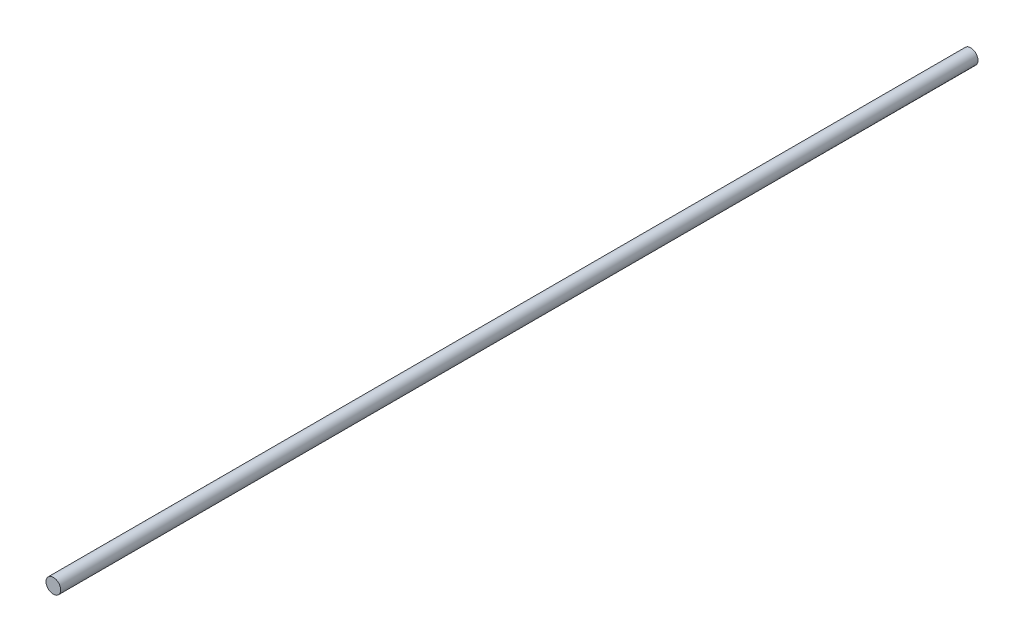
ISO-10303-21;
HEADER;
FILE_DESCRIPTION(('STEP AP214'),'2;1');
FILE_NAME('part.step','',(''),(''),'','','');
FILE_SCHEMA(('AUTOMOTIVE_DESIGN { 1 0 10303 214 1 1 1 1 }'));
ENDSEC;
DATA;
#1=APPLICATION_CONTEXT('core data for automotive mechanical design processes');
#2=APPLICATION_PROTOCOL_DEFINITION('international standard','automotive_design',2000,#1);
#3=PRODUCT_CONTEXT('',#1,'mechanical');
#4=PRODUCT('Part','Part','',(#3));
#5=PRODUCT_RELATED_PRODUCT_CATEGORY('part','',(#4));
#6=PRODUCT_DEFINITION_FORMATION('','',#4);
#7=PRODUCT_DEFINITION_CONTEXT('part definition',#1,'design');
#8=PRODUCT_DEFINITION('design','',#6,#7);
#9=PRODUCT_DEFINITION_SHAPE('','',#8);
#10=(LENGTH_UNIT() NAMED_UNIT(*) SI_UNIT(.MILLI.,.METRE.));
#11=(NAMED_UNIT(*) PLANE_ANGLE_UNIT() SI_UNIT($,.RADIAN.));
#12=(NAMED_UNIT(*) SI_UNIT($,.STERADIAN.) SOLID_ANGLE_UNIT());
#13=UNCERTAINTY_MEASURE_WITH_UNIT(LENGTH_MEASURE(1.E-05),#10,'distance_accuracy_value','');
#14=(GEOMETRIC_REPRESENTATION_CONTEXT(3) GLOBAL_UNCERTAINTY_ASSIGNED_CONTEXT((#13)) GLOBAL_UNIT_ASSIGNED_CONTEXT((#10,
#11,#12)) REPRESENTATION_CONTEXT('',''));
#15=CARTESIAN_POINT('',(0.,0.,0.));
#16=DIRECTION('',(0.,0.,1.));
#17=DIRECTION('',(1.,0.,0.));
#18=AXIS2_PLACEMENT_3D('',#15,#16,#17);
#19=CARTESIAN_POINT('',(0.,0.,-50.8));
#20=DIRECTION('',(0.,0.,1.));
#21=DIRECTION('',(1.,0.,0.));
#22=AXIS2_PLACEMENT_3D('',#19,#20,#21);
#23=CYLINDRICAL_SURFACE('',#22,0.406400000000001);
#24=CARTESIAN_POINT('',(0.,0.,-50.8));
#25=DIRECTION('',(0.,0.,1.));
#26=DIRECTION('',(1.,0.,0.));
#27=AXIS2_PLACEMENT_3D('',#24,#25,#26);
#28=CIRCLE('',#27,0.406400000000001);
#29=CARTESIAN_POINT('',(0.406400000000001,0.,-50.8));
#30=VERTEX_POINT('',#29);
#31=EDGE_CURVE('E10',#30,#30,#28,.T.);
#32=ORIENTED_EDGE('',*,*,#31,.T.);
#33=EDGE_LOOP('',(#32));
#34=FACE_BOUND('',#33,.T.);
#35=CARTESIAN_POINT('',(0.,0.,0.));
#36=DIRECTION('',(0.,0.,1.));
#37=DIRECTION('',(1.,0.,0.));
#38=AXIS2_PLACEMENT_3D('',#35,#36,#37);
#39=CIRCLE('',#38,0.406400000000001);
#40=CARTESIAN_POINT('',(0.406400000000001,0.,0.));
#41=VERTEX_POINT('',#40);
#42=EDGE_CURVE('E34',#41,#41,#39,.T.);
#43=ORIENTED_EDGE('',*,*,#42,.F.);
#44=EDGE_LOOP('',(#43));
#45=FACE_BOUND('',#44,.T.);
#46=ADVANCED_FACE('F31',(#34,#45),#23,.T.);
#47=CARTESIAN_POINT('',(0.,0.,-50.8));
#48=DIRECTION('',(0.,0.,1.));
#49=DIRECTION('',(1.,0.,0.));
#50=AXIS2_PLACEMENT_3D('',#47,#48,#49);
#51=PLANE('',#50);
#52=ORIENTED_EDGE('',*,*,#31,.F.);
#53=EDGE_LOOP('',(#52));
#54=FACE_BOUND('',#53,.T.);
#55=ADVANCED_FACE('F46',(#54),#51,.F.);
#56=CARTESIAN_POINT('',(0.,0.,0.));
#57=DIRECTION('',(0.,0.,1.));
#58=DIRECTION('',(1.,0.,0.));
#59=AXIS2_PLACEMENT_3D('',#56,#57,#58);
#60=PLANE('',#59);
#61=ORIENTED_EDGE('',*,*,#42,.T.);
#62=EDGE_LOOP('',(#61));
#63=FACE_BOUND('',#62,.T.);
#64=ADVANCED_FACE('F43',(#63),#60,.T.);
#65=CLOSED_SHELL('',(#46,#55,#64));
#66=MANIFOLD_SOLID_BREP('B2',#65);
#67=ADVANCED_BREP_SHAPE_REPRESENTATION('',(#18,#66),#14);
#68=SHAPE_DEFINITION_REPRESENTATION(#9,#67);
ENDSEC;
END-ISO-10303-21;
